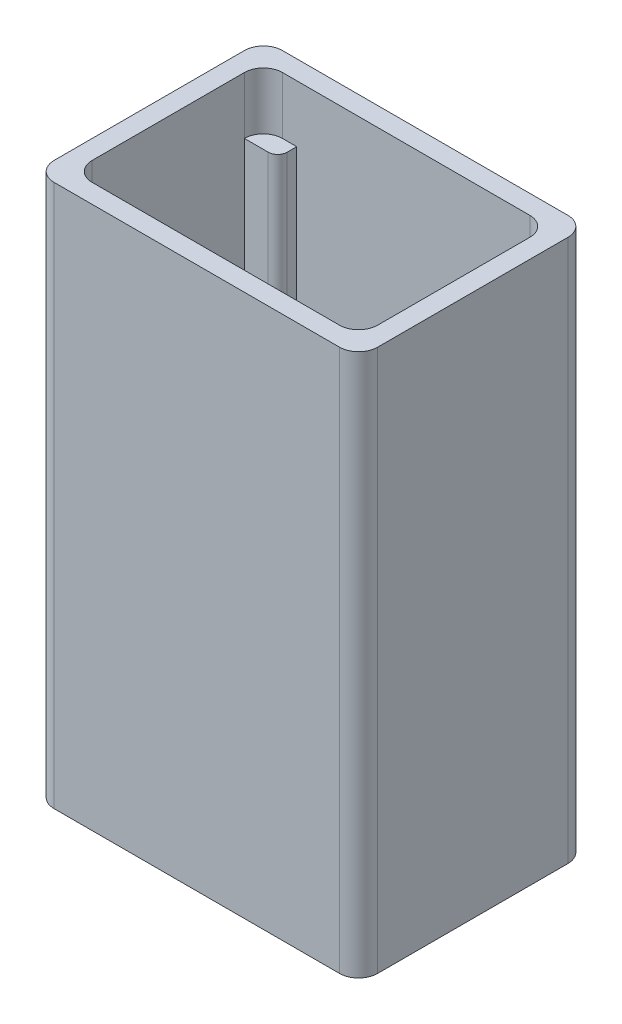
ISO-10303-21;
HEADER;
FILE_DESCRIPTION(('STEP AP214'),'2;1');
FILE_NAME('part.step','',(''),(''),'','','');
FILE_SCHEMA(('AUTOMOTIVE_DESIGN { 1 0 10303 214 1 1 1 1 }'));
ENDSEC;
DATA;
#1=APPLICATION_CONTEXT('core data for automotive mechanical design processes');
#2=APPLICATION_PROTOCOL_DEFINITION('international standard','automotive_design',2000,#1);
#3=PRODUCT_CONTEXT('',#1,'mechanical');
#4=PRODUCT('Part','Part','',(#3));
#5=PRODUCT_RELATED_PRODUCT_CATEGORY('part','',(#4));
#6=PRODUCT_DEFINITION_FORMATION('','',#4);
#7=PRODUCT_DEFINITION_CONTEXT('part definition',#1,'design');
#8=PRODUCT_DEFINITION('design','',#6,#7);
#9=PRODUCT_DEFINITION_SHAPE('','',#8);
#10=(LENGTH_UNIT() NAMED_UNIT(*) SI_UNIT(.MILLI.,.METRE.));
#11=(NAMED_UNIT(*) PLANE_ANGLE_UNIT() SI_UNIT($,.RADIAN.));
#12=(NAMED_UNIT(*) SI_UNIT($,.STERADIAN.) SOLID_ANGLE_UNIT());
#13=UNCERTAINTY_MEASURE_WITH_UNIT(LENGTH_MEASURE(1.E-05),#10,'distance_accuracy_value','');
#14=(GEOMETRIC_REPRESENTATION_CONTEXT(3) GLOBAL_UNCERTAINTY_ASSIGNED_CONTEXT((#13)) GLOBAL_UNIT_ASSIGNED_CONTEXT((#10,
#11,#12)) REPRESENTATION_CONTEXT('',''));
#15=CARTESIAN_POINT('',(0.,0.,0.));
#16=DIRECTION('',(0.,0.,1.));
#17=DIRECTION('',(1.,0.,0.));
#18=AXIS2_PLACEMENT_3D('',#15,#16,#17);
#19=CARTESIAN_POINT('',(-13.,115.,-10.));
#20=DIRECTION('',(0.,0.,1.));
#21=DIRECTION('',(1.,0.,0.));
#22=AXIS2_PLACEMENT_3D('',#19,#20,#21);
#23=PLANE('',#22);
#24=DIRECTION('',(-1.,0.,0.));
#25=VECTOR('',#24,1.);
#26=CARTESIAN_POINT('',(-11.5,109.,-10.));
#27=LINE('',#26,#25);
#28=CARTESIAN_POINT('',(-11.5,109.,-10.));
#29=VERTEX_POINT('',#28);
#30=CARTESIAN_POINT('',(-13.,109.,-10.));
#31=VERTEX_POINT('',#30);
#32=EDGE_CURVE('E47',#29,#31,#27,.T.);
#33=ORIENTED_EDGE('',*,*,#32,.F.);
#34=DIRECTION('',(0.,-1.,0.));
#35=VECTOR('',#34,1.);
#36=CARTESIAN_POINT('',(-11.5,109.,-10.));
#37=LINE('',#36,#35);
#38=CARTESIAN_POINT('',(-11.5,58.,-10.));
#39=VERTEX_POINT('',#38);
#40=EDGE_CURVE('E52',#29,#39,#37,.T.);
#41=ORIENTED_EDGE('',*,*,#40,.T.);
#42=DIRECTION('',(-1.,0.,0.));
#43=VECTOR('',#42,1.);
#44=CARTESIAN_POINT('',(-13.,58.,-10.));
#45=LINE('',#44,#43);
#46=CARTESIAN_POINT('',(11.5,58.,-10.));
#47=VERTEX_POINT('',#46);
#48=EDGE_CURVE('E274',#47,#39,#45,.T.);
#49=ORIENTED_EDGE('',*,*,#48,.F.);
#50=DIRECTION('',(0.,-1.,0.));
#51=VECTOR('',#50,1.);
#52=CARTESIAN_POINT('',(11.5,109.,-10.));
#53=LINE('',#52,#51);
#54=CARTESIAN_POINT('',(11.5,109.,-10.));
#55=VERTEX_POINT('',#54);
#56=EDGE_CURVE('E243',#55,#47,#53,.T.);
#57=ORIENTED_EDGE('',*,*,#56,.F.);
#58=DIRECTION('',(1.,0.,0.));
#59=VECTOR('',#58,1.);
#60=CARTESIAN_POINT('',(-13.,109.,-10.));
#61=LINE('',#60,#59);
#62=CARTESIAN_POINT('',(13.,109.,-10.));
#63=VERTEX_POINT('',#62);
#64=EDGE_CURVE('E40',#55,#63,#61,.T.);
#65=ORIENTED_EDGE('',*,*,#64,.T.);
#66=DIRECTION('',(0.,-1.,0.));
#67=VECTOR('',#66,1.);
#68=CARTESIAN_POINT('',(13.,115.,-10.));
#69=LINE('',#68,#67);
#70=CARTESIAN_POINT('',(13.,115.,-10.));
#71=VERTEX_POINT('',#70);
#72=EDGE_CURVE('E295',#71,#63,#69,.T.);
#73=ORIENTED_EDGE('',*,*,#72,.F.);
#74=DIRECTION('',(-1.,0.,0.));
#75=VECTOR('',#74,1.);
#76=CARTESIAN_POINT('',(-13.,115.,-10.));
#77=LINE('',#76,#75);
#78=CARTESIAN_POINT('',(-13.,115.,-10.));
#79=VERTEX_POINT('',#78);
#80=EDGE_CURVE('E257',#71,#79,#77,.T.);
#81=ORIENTED_EDGE('',*,*,#80,.T.);
#82=DIRECTION('',(0.,-1.,0.));
#83=VECTOR('',#82,1.);
#84=CARTESIAN_POINT('',(-13.,115.,-10.));
#85=LINE('',#84,#83);
#86=EDGE_CURVE('E293',#79,#31,#85,.T.);
#87=ORIENTED_EDGE('',*,*,#86,.T.);
#88=EDGE_LOOP('',(#33,#41,#49,#57,#65,#73,#81,#87));
#89=FACE_BOUND('',#88,.T.);
#90=ADVANCED_FACE('F32',(#89),#23,.T.);
#91=CARTESIAN_POINT('',(13.,115.,-8.00000000000001));
#92=DIRECTION('',(0.,-1.,0.));
#93=DIRECTION('',(0.,0.,-1.));
#94=AXIS2_PLACEMENT_3D('',#91,#92,#93);
#95=CYLINDRICAL_SURFACE('',#94,2.);
#96=ORIENTED_EDGE('',*,*,#72,.T.);
#97=CARTESIAN_POINT('',(13.,109.,-8.00000000000001));
#98=DIRECTION('',(0.,-1.,0.));
#99=DIRECTION('',(0.,0.,-1.));
#100=AXIS2_PLACEMENT_3D('',#97,#98,#99);
#101=CIRCLE('',#100,2.);
#102=CARTESIAN_POINT('',(15.,109.,-7.99999999999999));
#103=VERTEX_POINT('',#102);
#104=EDGE_CURVE('E246',#63,#103,#101,.T.);
#105=ORIENTED_EDGE('',*,*,#104,.T.);
#106=DIRECTION('',(0.,-1.,0.));
#107=VECTOR('',#106,1.);
#108=CARTESIAN_POINT('',(15.,115.,-7.99999999999999));
#109=LINE('',#108,#107);
#110=CARTESIAN_POINT('',(15.,115.,-7.99999999999999));
#111=VERTEX_POINT('',#110);
#112=EDGE_CURVE('E298',#111,#103,#109,.T.);
#113=ORIENTED_EDGE('',*,*,#112,.F.);
#114=CARTESIAN_POINT('',(13.,115.,-8.00000000000001));
#115=DIRECTION('',(0.,1.,0.));
#116=DIRECTION('',(0.,0.,-1.));
#117=AXIS2_PLACEMENT_3D('',#114,#115,#116);
#118=CIRCLE('',#117,2.);
#119=EDGE_CURVE('E255',#111,#71,#118,.T.);
#120=ORIENTED_EDGE('',*,*,#119,.T.);
#121=EDGE_LOOP('',(#96,#105,#113,#120));
#122=FACE_BOUND('',#121,.T.);
#123=ADVANCED_FACE('F368',(#122),#95,.F.);
#124=CARTESIAN_POINT('',(15.,115.,10.));
#125=DIRECTION('',(0.,-1.,0.));
#126=DIRECTION('',(0.,0.,-1.));
#127=AXIS2_PLACEMENT_3D('',#124,#125,#126);
#128=PLANE('',#127);
#129=CARTESIAN_POINT('',(15.,115.,10.));
#130=DIRECTION('',(0.,1.,0.));
#131=DIRECTION('',(0.,0.,-1.));
#132=AXIS2_PLACEMENT_3D('',#129,#130,#131);
#133=CIRCLE('',#132,2.);
#134=CARTESIAN_POINT('',(15.,115.,12.));
#135=VERTEX_POINT('',#134);
#136=CARTESIAN_POINT('',(17.,115.,10.));
#137=VERTEX_POINT('',#136);
#138=EDGE_CURVE('E305',#135,#137,#133,.T.);
#139=ORIENTED_EDGE('',*,*,#138,.T.);
#140=DIRECTION('',(0.,0.,-1.));
#141=VECTOR('',#140,1.);
#142=CARTESIAN_POINT('',(17.,115.,10.));
#143=LINE('',#142,#141);
#144=CARTESIAN_POINT('',(17.,115.,-10.));
#145=VERTEX_POINT('',#144);
#146=EDGE_CURVE('E308',#137,#145,#143,.T.);
#147=ORIENTED_EDGE('',*,*,#146,.T.);
#148=CARTESIAN_POINT('',(15.,115.,-10.));
#149=DIRECTION('',(0.,1.,0.));
#150=DIRECTION('',(0.,0.,-1.));
#151=AXIS2_PLACEMENT_3D('',#148,#149,#150);
#152=CIRCLE('',#151,2.);
#153=CARTESIAN_POINT('',(15.,115.,-12.));
#154=VERTEX_POINT('',#153);
#155=EDGE_CURVE('E311',#145,#154,#152,.T.);
#156=ORIENTED_EDGE('',*,*,#155,.T.);
#157=DIRECTION('',(-1.,0.,0.));
#158=VECTOR('',#157,1.);
#159=CARTESIAN_POINT('',(-15.,115.,-12.));
#160=LINE('',#159,#158);
#161=CARTESIAN_POINT('',(-15.,115.,-12.));
#162=VERTEX_POINT('',#161);
#163=EDGE_CURVE('E313',#154,#162,#160,.T.);
#164=ORIENTED_EDGE('',*,*,#163,.T.);
#165=CARTESIAN_POINT('',(-15.,115.,-10.));
#166=DIRECTION('',(0.,1.,0.));
#167=DIRECTION('',(0.,0.,1.));
#168=AXIS2_PLACEMENT_3D('',#165,#166,#167);
#169=CIRCLE('',#168,2.);
#170=CARTESIAN_POINT('',(-17.,115.,-10.));
#171=VERTEX_POINT('',#170);
#172=EDGE_CURVE('E315',#162,#171,#169,.T.);
#173=ORIENTED_EDGE('',*,*,#172,.T.);
#174=DIRECTION('',(0.,0.,1.));
#175=VECTOR('',#174,1.);
#176=CARTESIAN_POINT('',(-17.,115.,10.));
#177=LINE('',#176,#175);
#178=CARTESIAN_POINT('',(-17.,115.,10.));
#179=VERTEX_POINT('',#178);
#180=EDGE_CURVE('E317',#171,#179,#177,.T.);
#181=ORIENTED_EDGE('',*,*,#180,.T.);
#182=CARTESIAN_POINT('',(-15.,115.,10.));
#183=DIRECTION('',(0.,1.,0.));
#184=DIRECTION('',(0.,0.,1.));
#185=AXIS2_PLACEMENT_3D('',#182,#183,#184);
#186=CIRCLE('',#185,2.);
#187=CARTESIAN_POINT('',(-15.,115.,12.));
#188=VERTEX_POINT('',#187);
#189=EDGE_CURVE('E319',#179,#188,#186,.T.);
#190=ORIENTED_EDGE('',*,*,#189,.T.);
#191=DIRECTION('',(1.,0.,0.));
#192=VECTOR('',#191,1.);
#193=CARTESIAN_POINT('',(-15.,115.,12.));
#194=LINE('',#193,#192);
#195=EDGE_CURVE('E321',#188,#135,#194,.T.);
#196=ORIENTED_EDGE('',*,*,#195,.T.);
#197=EDGE_LOOP('',(#139,#147,#156,#164,#173,#181,#190,#196));
#198=FACE_BOUND('',#197,.T.);
#199=CARTESIAN_POINT('',(13.,115.,8.));
#200=DIRECTION('',(0.,1.,0.));
#201=DIRECTION('',(0.,0.,-1.));
#202=AXIS2_PLACEMENT_3D('',#199,#200,#201);
#203=CIRCLE('',#202,2.);
#204=CARTESIAN_POINT('',(13.,115.,10.));
#205=VERTEX_POINT('',#204);
#206=CARTESIAN_POINT('',(15.,115.,8.));
#207=VERTEX_POINT('',#206);
#208=EDGE_CURVE('E250',#205,#207,#203,.T.);
#209=ORIENTED_EDGE('',*,*,#208,.F.);
#210=DIRECTION('',(1.,0.,0.));
#211=VECTOR('',#210,1.);
#212=CARTESIAN_POINT('',(-13.,115.,10.));
#213=LINE('',#212,#211);
#214=CARTESIAN_POINT('',(-13.,115.,10.));
#215=VERTEX_POINT('',#214);
#216=EDGE_CURVE('E266',#215,#205,#213,.T.);
#217=ORIENTED_EDGE('',*,*,#216,.F.);
#218=CARTESIAN_POINT('',(-13.,115.,8.));
#219=DIRECTION('',(0.,1.,0.));
#220=DIRECTION('',(0.,0.,1.));
#221=AXIS2_PLACEMENT_3D('',#218,#219,#220);
#222=CIRCLE('',#221,2.);
#223=CARTESIAN_POINT('',(-15.,115.,8.));
#224=VERTEX_POINT('',#223);
#225=EDGE_CURVE('E263',#224,#215,#222,.T.);
#226=ORIENTED_EDGE('',*,*,#225,.F.);
#227=DIRECTION('',(0.,0.,1.));
#228=VECTOR('',#227,1.);
#229=CARTESIAN_POINT('',(-15.,115.,8.));
#230=LINE('',#229,#228);
#231=CARTESIAN_POINT('',(-15.,115.,-7.99999999999999));
#232=VERTEX_POINT('',#231);
#233=EDGE_CURVE('E261',#232,#224,#230,.T.);
#234=ORIENTED_EDGE('',*,*,#233,.F.);
#235=CARTESIAN_POINT('',(-13.,115.,-8.));
#236=DIRECTION('',(0.,1.,0.));
#237=DIRECTION('',(0.,0.,1.));
#238=AXIS2_PLACEMENT_3D('',#235,#236,#237);
#239=CIRCLE('',#238,2.);
#240=EDGE_CURVE('E259',#79,#232,#239,.T.);
#241=ORIENTED_EDGE('',*,*,#240,.F.);
#242=ORIENTED_EDGE('',*,*,#80,.F.);
#243=ORIENTED_EDGE('',*,*,#119,.F.);
#244=DIRECTION('',(0.,0.,-1.));
#245=VECTOR('',#244,1.);
#246=CARTESIAN_POINT('',(15.,115.,8.));
#247=LINE('',#246,#245);
#248=EDGE_CURVE('E252',#207,#111,#247,.T.);
#249=ORIENTED_EDGE('',*,*,#248,.F.);
#250=EDGE_LOOP('',(#209,#217,#226,#234,#241,#242,#243,#249));
#251=FACE_BOUND('',#250,.T.);
#252=ADVANCED_FACE('F374',(#198,#251),#128,.F.);
#253=CARTESIAN_POINT('',(15.,58.,10.));
#254=DIRECTION('',(0.,-1.,0.));
#255=DIRECTION('',(0.,0.,-1.));
#256=AXIS2_PLACEMENT_3D('',#253,#254,#255);
#257=PLANE('',#256);
#258=ORIENTED_EDGE('',*,*,#48,.T.);
#259=DIRECTION('',(0.,0.,-1.));
#260=VECTOR('',#259,1.);
#261=CARTESIAN_POINT('',(-11.5,58.,-9.));
#262=LINE('',#261,#260);
#263=CARTESIAN_POINT('',(-11.5,58.,-9.));
#264=VERTEX_POINT('',#263);
#265=EDGE_CURVE('E213',#264,#39,#262,.T.);
#266=ORIENTED_EDGE('',*,*,#265,.F.);
#267=CARTESIAN_POINT('',(-12.5,58.,-8.99999999999999));
#268=DIRECTION('',(0.,1.,0.));
#269=DIRECTION('',(0.,0.,1.));
#270=AXIS2_PLACEMENT_3D('',#267,#268,#269);
#271=CIRCLE('',#270,1.);
#272=CARTESIAN_POINT('',(-12.5,58.,-7.99999999999999));
#273=VERTEX_POINT('',#272);
#274=EDGE_CURVE('E217',#273,#264,#271,.T.);
#275=ORIENTED_EDGE('',*,*,#274,.F.);
#276=DIRECTION('',(1.,0.,0.));
#277=VECTOR('',#276,1.);
#278=CARTESIAN_POINT('',(-15.,58.,-7.99999999999999));
#279=LINE('',#278,#277);
#280=CARTESIAN_POINT('',(-15.,58.,-7.99999999999999));
#281=VERTEX_POINT('',#280);
#282=EDGE_CURVE('E200',#281,#273,#279,.T.);
#283=ORIENTED_EDGE('',*,*,#282,.F.);
#284=DIRECTION('',(0.,0.,1.));
#285=VECTOR('',#284,1.);
#286=CARTESIAN_POINT('',(-15.,58.,8.));
#287=LINE('',#286,#285);
#288=CARTESIAN_POINT('',(-15.,58.,8.));
#289=VERTEX_POINT('',#288);
#290=EDGE_CURVE('E276',#281,#289,#287,.T.);
#291=ORIENTED_EDGE('',*,*,#290,.T.);
#292=CARTESIAN_POINT('',(-13.,58.,8.));
#293=DIRECTION('',(0.,1.,0.));
#294=DIRECTION('',(0.,0.,1.));
#295=AXIS2_PLACEMENT_3D('',#292,#293,#294);
#296=CIRCLE('',#295,2.);
#297=CARTESIAN_POINT('',(-13.,58.,10.));
#298=VERTEX_POINT('',#297);
#299=EDGE_CURVE('E279',#289,#298,#296,.T.);
#300=ORIENTED_EDGE('',*,*,#299,.T.);
#301=DIRECTION('',(1.,0.,0.));
#302=VECTOR('',#301,1.);
#303=CARTESIAN_POINT('',(-13.,58.,10.));
#304=LINE('',#303,#302);
#305=CARTESIAN_POINT('',(13.,58.,10.));
#306=VERTEX_POINT('',#305);
#307=EDGE_CURVE('E253',#298,#306,#304,.T.);
#308=ORIENTED_EDGE('',*,*,#307,.T.);
#309=CARTESIAN_POINT('',(13.,58.,8.));
#310=DIRECTION('',(0.,1.,0.));
#311=DIRECTION('',(0.,0.,-1.));
#312=AXIS2_PLACEMENT_3D('',#309,#310,#311);
#313=CIRCLE('',#312,2.);
#314=CARTESIAN_POINT('',(15.,58.,8.));
#315=VERTEX_POINT('',#314);
#316=EDGE_CURVE('E249',#306,#315,#313,.T.);
#317=ORIENTED_EDGE('',*,*,#316,.T.);
#318=DIRECTION('',(0.,0.,-1.));
#319=VECTOR('',#318,1.);
#320=CARTESIAN_POINT('',(15.,58.,8.));
#321=LINE('',#320,#319);
#322=CARTESIAN_POINT('',(15.,58.,-7.99999999999999));
#323=VERTEX_POINT('',#322);
#324=EDGE_CURVE('E271',#315,#323,#321,.T.);
#325=ORIENTED_EDGE('',*,*,#324,.T.);
#326=DIRECTION('',(1.,0.,0.));
#327=VECTOR('',#326,1.);
#328=CARTESIAN_POINT('',(15.,58.,-7.99999999999999));
#329=LINE('',#328,#327);
#330=CARTESIAN_POINT('',(12.5,58.,-7.99999999999999));
#331=VERTEX_POINT('',#330);
#332=EDGE_CURVE('E226',#331,#323,#329,.T.);
#333=ORIENTED_EDGE('',*,*,#332,.F.);
#334=CARTESIAN_POINT('',(12.5,58.,-8.99999999999999));
#335=DIRECTION('',(0.,1.,0.));
#336=DIRECTION('',(0.,0.,-1.));
#337=AXIS2_PLACEMENT_3D('',#334,#335,#336);
#338=CIRCLE('',#337,1.);
#339=CARTESIAN_POINT('',(11.5,58.,-9.));
#340=VERTEX_POINT('',#339);
#341=EDGE_CURVE('E232',#340,#331,#338,.T.);
#342=ORIENTED_EDGE('',*,*,#341,.F.);
#343=DIRECTION('',(0.,0.,1.));
#344=VECTOR('',#343,1.);
#345=CARTESIAN_POINT('',(11.5,58.,-9.));
#346=LINE('',#345,#344);
#347=EDGE_CURVE('E222',#47,#340,#346,.T.);
#348=ORIENTED_EDGE('',*,*,#347,.F.);
#349=EDGE_LOOP('',(#258,#266,#275,#283,#291,#300,#308,#317,#325,#333,#342,#348));
#350=FACE_BOUND('',#349,.T.);
#351=CARTESIAN_POINT('',(15.,58.,10.));
#352=DIRECTION('',(0.,1.,0.));
#353=DIRECTION('',(0.,0.,-1.));
#354=AXIS2_PLACEMENT_3D('',#351,#352,#353);
#355=CIRCLE('',#354,2.);
#356=CARTESIAN_POINT('',(15.,58.,12.));
#357=VERTEX_POINT('',#356);
#358=CARTESIAN_POINT('',(17.,58.,10.));
#359=VERTEX_POINT('',#358);
#360=EDGE_CURVE('E304',#357,#359,#355,.T.);
#361=ORIENTED_EDGE('',*,*,#360,.F.);
#362=DIRECTION('',(1.,0.,0.));
#363=VECTOR('',#362,1.);
#364=CARTESIAN_POINT('',(-15.,58.,12.));
#365=LINE('',#364,#363);
#366=CARTESIAN_POINT('',(-15.,58.,12.));
#367=VERTEX_POINT('',#366);
#368=EDGE_CURVE('E309',#367,#357,#365,.T.);
#369=ORIENTED_EDGE('',*,*,#368,.F.);
#370=CARTESIAN_POINT('',(-15.,58.,10.));
#371=DIRECTION('',(0.,1.,0.));
#372=DIRECTION('',(0.,0.,1.));
#373=AXIS2_PLACEMENT_3D('',#370,#371,#372);
#374=CIRCLE('',#373,2.);
#375=CARTESIAN_POINT('',(-17.,58.,10.));
#376=VERTEX_POINT('',#375);
#377=EDGE_CURVE('E336',#376,#367,#374,.T.);
#378=ORIENTED_EDGE('',*,*,#377,.F.);
#379=DIRECTION('',(0.,0.,1.));
#380=VECTOR('',#379,1.);
#381=CARTESIAN_POINT('',(-17.,58.,10.));
#382=LINE('',#381,#380);
#383=CARTESIAN_POINT('',(-17.,58.,-10.));
#384=VERTEX_POINT('',#383);
#385=EDGE_CURVE('E334',#384,#376,#382,.T.);
#386=ORIENTED_EDGE('',*,*,#385,.F.);
#387=CARTESIAN_POINT('',(-15.,58.,-10.));
#388=DIRECTION('',(0.,1.,0.));
#389=DIRECTION('',(0.,0.,1.));
#390=AXIS2_PLACEMENT_3D('',#387,#388,#389);
#391=CIRCLE('',#390,2.);
#392=CARTESIAN_POINT('',(-15.,58.,-12.));
#393=VERTEX_POINT('',#392);
#394=EDGE_CURVE('E332',#393,#384,#391,.T.);
#395=ORIENTED_EDGE('',*,*,#394,.F.);
#396=DIRECTION('',(-1.,0.,0.));
#397=VECTOR('',#396,1.);
#398=CARTESIAN_POINT('',(-15.,58.,-12.));
#399=LINE('',#398,#397);
#400=CARTESIAN_POINT('',(15.,58.,-12.));
#401=VERTEX_POINT('',#400);
#402=EDGE_CURVE('E330',#401,#393,#399,.T.);
#403=ORIENTED_EDGE('',*,*,#402,.F.);
#404=CARTESIAN_POINT('',(15.,58.,-10.));
#405=DIRECTION('',(0.,1.,0.));
#406=DIRECTION('',(0.,0.,-1.));
#407=AXIS2_PLACEMENT_3D('',#404,#405,#406);
#408=CIRCLE('',#407,2.);
#409=CARTESIAN_POINT('',(17.,58.,-10.));
#410=VERTEX_POINT('',#409);
#411=EDGE_CURVE('E328',#410,#401,#408,.T.);
#412=ORIENTED_EDGE('',*,*,#411,.F.);
#413=DIRECTION('',(0.,0.,-1.));
#414=VECTOR('',#413,1.);
#415=CARTESIAN_POINT('',(17.,58.,10.));
#416=LINE('',#415,#414);
#417=EDGE_CURVE('E326',#359,#410,#416,.T.);
#418=ORIENTED_EDGE('',*,*,#417,.F.);
#419=EDGE_LOOP('',(#361,#369,#378,#386,#395,#403,#412,#418));
#420=FACE_BOUND('',#419,.T.);
#421=ADVANCED_FACE('F391',(#350,#420),#257,.T.);
#422=CARTESIAN_POINT('',(15.,115.,10.));
#423=DIRECTION('',(0.,-1.,0.));
#424=DIRECTION('',(0.,0.,-1.));
#425=AXIS2_PLACEMENT_3D('',#422,#423,#424);
#426=CYLINDRICAL_SURFACE('',#425,2.);
#427=ORIENTED_EDGE('',*,*,#360,.T.);
#428=DIRECTION('',(0.,-1.,0.));
#429=VECTOR('',#428,1.);
#430=CARTESIAN_POINT('',(17.,115.,10.));
#431=LINE('',#430,#429);
#432=EDGE_CURVE('E359',#137,#359,#431,.T.);
#433=ORIENTED_EDGE('',*,*,#432,.F.);
#434=ORIENTED_EDGE('',*,*,#138,.F.);
#435=DIRECTION('',(0.,-1.,0.));
#436=VECTOR('',#435,1.);
#437=CARTESIAN_POINT('',(15.,115.,12.));
#438=LINE('',#437,#436);
#439=EDGE_CURVE('E323',#135,#357,#438,.T.);
#440=ORIENTED_EDGE('',*,*,#439,.T.);
#441=EDGE_LOOP('',(#427,#433,#434,#440));
#442=FACE_BOUND('',#441,.T.);
#443=ADVANCED_FACE('F34',(#442),#426,.T.);
#444=CARTESIAN_POINT('',(17.,115.,10.));
#445=DIRECTION('',(-1.,0.,0.));
#446=DIRECTION('',(0.,0.,1.));
#447=AXIS2_PLACEMENT_3D('',#444,#445,#446);
#448=PLANE('',#447);
#449=ORIENTED_EDGE('',*,*,#417,.T.);
#450=DIRECTION('',(0.,-1.,0.));
#451=VECTOR('',#450,1.);
#452=CARTESIAN_POINT('',(17.,115.,-10.));
#453=LINE('',#452,#451);
#454=EDGE_CURVE('E356',#145,#410,#453,.T.);
#455=ORIENTED_EDGE('',*,*,#454,.F.);
#456=ORIENTED_EDGE('',*,*,#146,.F.);
#457=ORIENTED_EDGE('',*,*,#432,.T.);
#458=EDGE_LOOP('',(#449,#455,#456,#457));
#459=FACE_BOUND('',#458,.T.);
#460=ADVANCED_FACE('F451',(#459),#448,.F.);
#461=CARTESIAN_POINT('',(15.,115.,-10.));
#462=DIRECTION('',(0.,-1.,0.));
#463=DIRECTION('',(0.,0.,-1.));
#464=AXIS2_PLACEMENT_3D('',#461,#462,#463);
#465=CYLINDRICAL_SURFACE('',#464,2.);
#466=ORIENTED_EDGE('',*,*,#411,.T.);
#467=DIRECTION('',(0.,-1.,0.));
#468=VECTOR('',#467,1.);
#469=CARTESIAN_POINT('',(15.,115.,-12.));
#470=LINE('',#469,#468);
#471=EDGE_CURVE('E353',#154,#401,#470,.T.);
#472=ORIENTED_EDGE('',*,*,#471,.F.);
#473=ORIENTED_EDGE('',*,*,#155,.F.);
#474=ORIENTED_EDGE('',*,*,#454,.T.);
#475=EDGE_LOOP('',(#466,#472,#473,#474));
#476=FACE_BOUND('',#475,.T.);
#477=ADVANCED_FACE('F448',(#476),#465,.T.);
#478=CARTESIAN_POINT('',(-15.,115.,-12.));
#479=DIRECTION('',(0.,0.,1.));
#480=DIRECTION('',(1.,0.,0.));
#481=AXIS2_PLACEMENT_3D('',#478,#479,#480);
#482=PLANE('',#481);
#483=ORIENTED_EDGE('',*,*,#402,.T.);
#484=DIRECTION('',(0.,-1.,0.));
#485=VECTOR('',#484,1.);
#486=CARTESIAN_POINT('',(-15.,115.,-12.));
#487=LINE('',#486,#485);
#488=EDGE_CURVE('E350',#162,#393,#487,.T.);
#489=ORIENTED_EDGE('',*,*,#488,.F.);
#490=ORIENTED_EDGE('',*,*,#163,.F.);
#491=ORIENTED_EDGE('',*,*,#471,.T.);
#492=EDGE_LOOP('',(#483,#489,#490,#491));
#493=FACE_BOUND('',#492,.T.);
#494=ADVANCED_FACE('F444',(#493),#482,.F.);
#495=CARTESIAN_POINT('',(-15.,115.,-10.));
#496=DIRECTION('',(0.,-1.,0.));
#497=DIRECTION('',(0.,0.,-1.));
#498=AXIS2_PLACEMENT_3D('',#495,#496,#497);
#499=CYLINDRICAL_SURFACE('',#498,2.);
#500=ORIENTED_EDGE('',*,*,#394,.T.);
#501=DIRECTION('',(0.,-1.,0.));
#502=VECTOR('',#501,1.);
#503=CARTESIAN_POINT('',(-17.,115.,-10.));
#504=LINE('',#503,#502);
#505=EDGE_CURVE('E347',#171,#384,#504,.T.);
#506=ORIENTED_EDGE('',*,*,#505,.F.);
#507=ORIENTED_EDGE('',*,*,#172,.F.);
#508=ORIENTED_EDGE('',*,*,#488,.T.);
#509=EDGE_LOOP('',(#500,#506,#507,#508));
#510=FACE_BOUND('',#509,.T.);
#511=ADVANCED_FACE('F440',(#510),#499,.T.);
#512=CARTESIAN_POINT('',(-17.,115.,10.));
#513=DIRECTION('',(1.,0.,0.));
#514=DIRECTION('',(0.,0.,-1.));
#515=AXIS2_PLACEMENT_3D('',#512,#513,#514);
#516=PLANE('',#515);
#517=ORIENTED_EDGE('',*,*,#385,.T.);
#518=DIRECTION('',(0.,-1.,0.));
#519=VECTOR('',#518,1.);
#520=CARTESIAN_POINT('',(-17.,115.,10.));
#521=LINE('',#520,#519);
#522=EDGE_CURVE('E344',#179,#376,#521,.T.);
#523=ORIENTED_EDGE('',*,*,#522,.F.);
#524=ORIENTED_EDGE('',*,*,#180,.F.);
#525=ORIENTED_EDGE('',*,*,#505,.T.);
#526=EDGE_LOOP('',(#517,#523,#524,#525));
#527=FACE_BOUND('',#526,.T.);
#528=ADVANCED_FACE('F436',(#527),#516,.F.);
#529=CARTESIAN_POINT('',(-15.,115.,10.));
#530=DIRECTION('',(0.,-1.,0.));
#531=DIRECTION('',(0.,0.,-1.));
#532=AXIS2_PLACEMENT_3D('',#529,#530,#531);
#533=CYLINDRICAL_SURFACE('',#532,2.);
#534=ORIENTED_EDGE('',*,*,#377,.T.);
#535=DIRECTION('',(0.,-1.,0.));
#536=VECTOR('',#535,1.);
#537=CARTESIAN_POINT('',(-15.,115.,12.));
#538=LINE('',#537,#536);
#539=EDGE_CURVE('E341',#188,#367,#538,.T.);
#540=ORIENTED_EDGE('',*,*,#539,.F.);
#541=ORIENTED_EDGE('',*,*,#189,.F.);
#542=ORIENTED_EDGE('',*,*,#522,.T.);
#543=EDGE_LOOP('',(#534,#540,#541,#542));
#544=FACE_BOUND('',#543,.T.);
#545=ADVANCED_FACE('F432',(#544),#533,.T.);
#546=CARTESIAN_POINT('',(-15.,115.,12.));
#547=DIRECTION('',(0.,0.,-1.));
#548=DIRECTION('',(-1.,0.,0.));
#549=AXIS2_PLACEMENT_3D('',#546,#547,#548);
#550=PLANE('',#549);
#551=ORIENTED_EDGE('',*,*,#368,.T.);
#552=ORIENTED_EDGE('',*,*,#439,.F.);
#553=ORIENTED_EDGE('',*,*,#195,.F.);
#554=ORIENTED_EDGE('',*,*,#539,.T.);
#555=EDGE_LOOP('',(#551,#552,#553,#554));
#556=FACE_BOUND('',#555,.T.);
#557=ADVANCED_FACE('F423',(#556),#550,.F.);
#558=CARTESIAN_POINT('',(13.,115.,8.));
#559=DIRECTION('',(0.,-1.,0.));
#560=DIRECTION('',(0.,0.,-1.));
#561=AXIS2_PLACEMENT_3D('',#558,#559,#560);
#562=CYLINDRICAL_SURFACE('',#561,2.);
#563=ORIENTED_EDGE('',*,*,#316,.F.);
#564=DIRECTION('',(0.,-1.,0.));
#565=VECTOR('',#564,1.);
#566=CARTESIAN_POINT('',(13.,115.,10.));
#567=LINE('',#566,#565);
#568=EDGE_CURVE('E268',#205,#306,#567,.T.);
#569=ORIENTED_EDGE('',*,*,#568,.F.);
#570=ORIENTED_EDGE('',*,*,#208,.T.);
#571=DIRECTION('',(0.,-1.,0.));
#572=VECTOR('',#571,1.);
#573=CARTESIAN_POINT('',(15.,115.,8.));
#574=LINE('',#573,#572);
#575=EDGE_CURVE('E301',#207,#315,#574,.T.);
#576=ORIENTED_EDGE('',*,*,#575,.T.);
#577=EDGE_LOOP('',(#563,#569,#570,#576));
#578=FACE_BOUND('',#577,.T.);
#579=ADVANCED_FACE('F419',(#578),#562,.F.);
#580=CARTESIAN_POINT('',(15.,115.,8.));
#581=DIRECTION('',(-1.,0.,0.));
#582=DIRECTION('',(0.,0.,1.));
#583=AXIS2_PLACEMENT_3D('',#580,#581,#582);
#584=PLANE('',#583);
#585=ORIENTED_EDGE('',*,*,#324,.F.);
#586=ORIENTED_EDGE('',*,*,#575,.F.);
#587=ORIENTED_EDGE('',*,*,#248,.T.);
#588=ORIENTED_EDGE('',*,*,#112,.T.);
#589=DIRECTION('',(0.,-1.,0.));
#590=VECTOR('',#589,1.);
#591=CARTESIAN_POINT('',(15.,109.,-7.99999999999999));
#592=LINE('',#591,#590);
#593=EDGE_CURVE('E230',#103,#323,#592,.T.);
#594=ORIENTED_EDGE('',*,*,#593,.T.);
#595=EDGE_LOOP('',(#585,#586,#587,#588,#594));
#596=FACE_BOUND('',#595,.T.);
#597=ADVANCED_FACE('F416',(#596),#584,.T.);
#598=CARTESIAN_POINT('',(-13.,115.,-8.));
#599=DIRECTION('',(0.,-1.,0.));
#600=DIRECTION('',(0.,0.,-1.));
#601=AXIS2_PLACEMENT_3D('',#598,#599,#600);
#602=CYLINDRICAL_SURFACE('',#601,2.);
#603=CARTESIAN_POINT('',(-13.,109.,-8.));
#604=DIRECTION('',(0.,1.,0.));
#605=DIRECTION('',(0.,0.,1.));
#606=AXIS2_PLACEMENT_3D('',#603,#604,#605);
#607=CIRCLE('',#606,2.);
#608=CARTESIAN_POINT('',(-15.,109.,-7.99999999999999));
#609=VERTEX_POINT('',#608);
#610=EDGE_CURVE('E11',#31,#609,#607,.T.);
#611=ORIENTED_EDGE('',*,*,#610,.F.);
#612=ORIENTED_EDGE('',*,*,#86,.F.);
#613=ORIENTED_EDGE('',*,*,#240,.T.);
#614=DIRECTION('',(0.,-1.,0.));
#615=VECTOR('',#614,1.);
#616=CARTESIAN_POINT('',(-15.,115.,-7.99999999999999));
#617=LINE('',#616,#615);
#618=EDGE_CURVE('E290',#232,#609,#617,.T.);
#619=ORIENTED_EDGE('',*,*,#618,.T.);
#620=EDGE_LOOP('',(#611,#612,#613,#619));
#621=FACE_BOUND('',#620,.T.);
#622=ADVANCED_FACE('F379',(#621),#602,.F.);
#623=CARTESIAN_POINT('',(-15.,115.,8.));
#624=DIRECTION('',(1.,0.,0.));
#625=DIRECTION('',(0.,0.,-1.));
#626=AXIS2_PLACEMENT_3D('',#623,#624,#625);
#627=PLANE('',#626);
#628=ORIENTED_EDGE('',*,*,#290,.F.);
#629=DIRECTION('',(0.,-1.,0.));
#630=VECTOR('',#629,1.);
#631=CARTESIAN_POINT('',(-15.,109.,-7.99999999999999));
#632=LINE('',#631,#630);
#633=EDGE_CURVE('E203',#609,#281,#632,.T.);
#634=ORIENTED_EDGE('',*,*,#633,.F.);
#635=ORIENTED_EDGE('',*,*,#618,.F.);
#636=ORIENTED_EDGE('',*,*,#233,.T.);
#637=DIRECTION('',(0.,-1.,0.));
#638=VECTOR('',#637,1.);
#639=CARTESIAN_POINT('',(-15.,115.,8.));
#640=LINE('',#639,#638);
#641=EDGE_CURVE('E288',#224,#289,#640,.T.);
#642=ORIENTED_EDGE('',*,*,#641,.T.);
#643=EDGE_LOOP('',(#628,#634,#635,#636,#642));
#644=FACE_BOUND('',#643,.T.);
#645=ADVANCED_FACE('F382',(#644),#627,.T.);
#646=CARTESIAN_POINT('',(-13.,115.,8.));
#647=DIRECTION('',(0.,-1.,0.));
#648=DIRECTION('',(0.,0.,-1.));
#649=AXIS2_PLACEMENT_3D('',#646,#647,#648);
#650=CYLINDRICAL_SURFACE('',#649,2.);
#651=ORIENTED_EDGE('',*,*,#299,.F.);
#652=ORIENTED_EDGE('',*,*,#641,.F.);
#653=ORIENTED_EDGE('',*,*,#225,.T.);
#654=DIRECTION('',(0.,-1.,0.));
#655=VECTOR('',#654,1.);
#656=CARTESIAN_POINT('',(-13.,115.,10.));
#657=LINE('',#656,#655);
#658=EDGE_CURVE('E286',#215,#298,#657,.T.);
#659=ORIENTED_EDGE('',*,*,#658,.T.);
#660=EDGE_LOOP('',(#651,#652,#653,#659));
#661=FACE_BOUND('',#660,.T.);
#662=ADVANCED_FACE('F388',(#661),#650,.F.);
#663=CARTESIAN_POINT('',(-13.,115.,10.));
#664=DIRECTION('',(0.,0.,-1.));
#665=DIRECTION('',(-1.,0.,0.));
#666=AXIS2_PLACEMENT_3D('',#663,#664,#665);
#667=PLANE('',#666);
#668=ORIENTED_EDGE('',*,*,#307,.F.);
#669=ORIENTED_EDGE('',*,*,#658,.F.);
#670=ORIENTED_EDGE('',*,*,#216,.T.);
#671=ORIENTED_EDGE('',*,*,#568,.T.);
#672=EDGE_LOOP('',(#668,#669,#670,#671));
#673=FACE_BOUND('',#672,.T.);
#674=ADVANCED_FACE('F507',(#673),#667,.T.);
#675=CARTESIAN_POINT('',(11.5,109.,-9.));
#676=DIRECTION('',(1.,0.,0.));
#677=DIRECTION('',(0.,0.,-1.));
#678=AXIS2_PLACEMENT_3D('',#675,#676,#677);
#679=PLANE('',#678);
#680=ORIENTED_EDGE('',*,*,#347,.T.);
#681=DIRECTION('',(0.,-1.,0.));
#682=VECTOR('',#681,1.);
#683=CARTESIAN_POINT('',(11.5,109.,-9.));
#684=LINE('',#683,#682);
#685=CARTESIAN_POINT('',(11.5,109.,-9.));
#686=VERTEX_POINT('',#685);
#687=EDGE_CURVE('E240',#686,#340,#684,.T.);
#688=ORIENTED_EDGE('',*,*,#687,.F.);
#689=DIRECTION('',(0.,0.,1.));
#690=VECTOR('',#689,1.);
#691=CARTESIAN_POINT('',(11.5,109.,-9.));
#692=LINE('',#691,#690);
#693=EDGE_CURVE('E223',#55,#686,#692,.T.);
#694=ORIENTED_EDGE('',*,*,#693,.F.);
#695=ORIENTED_EDGE('',*,*,#56,.T.);
#696=EDGE_LOOP('',(#680,#688,#694,#695));
#697=FACE_BOUND('',#696,.T.);
#698=ADVANCED_FACE('F511',(#697),#679,.F.);
#699=CARTESIAN_POINT('',(12.5,109.,-8.99999999999999));
#700=DIRECTION('',(0.,-1.,0.));
#701=DIRECTION('',(0.,0.,-1.));
#702=AXIS2_PLACEMENT_3D('',#699,#700,#701);
#703=CYLINDRICAL_SURFACE('',#702,1.);
#704=ORIENTED_EDGE('',*,*,#341,.T.);
#705=DIRECTION('',(0.,-1.,0.));
#706=VECTOR('',#705,1.);
#707=CARTESIAN_POINT('',(12.5,109.,-7.99999999999999));
#708=LINE('',#707,#706);
#709=CARTESIAN_POINT('',(12.5,109.,-7.99999999999999));
#710=VERTEX_POINT('',#709);
#711=EDGE_CURVE('E237',#710,#331,#708,.T.);
#712=ORIENTED_EDGE('',*,*,#711,.F.);
#713=CARTESIAN_POINT('',(12.5,109.,-8.99999999999999));
#714=DIRECTION('',(0.,1.,0.));
#715=DIRECTION('',(0.,0.,-1.));
#716=AXIS2_PLACEMENT_3D('',#713,#714,#715);
#717=CIRCLE('',#716,1.);
#718=EDGE_CURVE('E225',#686,#710,#717,.T.);
#719=ORIENTED_EDGE('',*,*,#718,.F.);
#720=ORIENTED_EDGE('',*,*,#687,.T.);
#721=EDGE_LOOP('',(#704,#712,#719,#720));
#722=FACE_BOUND('',#721,.T.);
#723=ADVANCED_FACE('F590',(#722),#703,.T.);
#724=CARTESIAN_POINT('',(15.,109.,-7.99999999999999));
#725=DIRECTION('',(0.,0.,-1.));
#726=DIRECTION('',(-1.,0.,0.));
#727=AXIS2_PLACEMENT_3D('',#724,#725,#726);
#728=PLANE('',#727);
#729=ORIENTED_EDGE('',*,*,#332,.T.);
#730=ORIENTED_EDGE('',*,*,#593,.F.);
#731=DIRECTION('',(1.,0.,0.));
#732=VECTOR('',#731,1.);
#733=CARTESIAN_POINT('',(15.,109.,-7.99999999999999));
#734=LINE('',#733,#732);
#735=EDGE_CURVE('E228',#710,#103,#734,.T.);
#736=ORIENTED_EDGE('',*,*,#735,.F.);
#737=ORIENTED_EDGE('',*,*,#711,.T.);
#738=EDGE_LOOP('',(#729,#730,#736,#737));
#739=FACE_BOUND('',#738,.T.);
#740=ADVANCED_FACE('F600',(#739),#728,.F.);
#741=CARTESIAN_POINT('',(12.5,109.,-8.99999999999999));
#742=DIRECTION('',(0.,-1.,0.));
#743=DIRECTION('',(0.,0.,-1.));
#744=AXIS2_PLACEMENT_3D('',#741,#742,#743);
#745=PLANE('',#744);
#746=ORIENTED_EDGE('',*,*,#104,.F.);
#747=ORIENTED_EDGE('',*,*,#64,.F.);
#748=ORIENTED_EDGE('',*,*,#693,.T.);
#749=ORIENTED_EDGE('',*,*,#718,.T.);
#750=ORIENTED_EDGE('',*,*,#735,.T.);
#751=EDGE_LOOP('',(#746,#747,#748,#749,#750));
#752=FACE_BOUND('',#751,.T.);
#753=ADVANCED_FACE('F404',(#752),#745,.F.);
#754=CARTESIAN_POINT('',(-12.5,109.,-8.99999999999999));
#755=DIRECTION('',(0.,1.,0.));
#756=DIRECTION('',(0.,0.,1.));
#757=AXIS2_PLACEMENT_3D('',#754,#755,#756);
#758=PLANE('',#757);
#759=ORIENTED_EDGE('',*,*,#32,.T.);
#760=ORIENTED_EDGE('',*,*,#610,.T.);
#761=DIRECTION('',(1.,0.,0.));
#762=VECTOR('',#761,1.);
#763=CARTESIAN_POINT('',(-15.,109.,-7.99999999999999));
#764=LINE('',#763,#762);
#765=CARTESIAN_POINT('',(-12.5,109.,-7.99999999999999));
#766=VERTEX_POINT('',#765);
#767=EDGE_CURVE('E187',#609,#766,#764,.T.);
#768=ORIENTED_EDGE('',*,*,#767,.T.);
#769=CARTESIAN_POINT('',(-12.5,109.,-8.99999999999999));
#770=DIRECTION('',(0.,1.,0.));
#771=DIRECTION('',(0.,0.,1.));
#772=AXIS2_PLACEMENT_3D('',#769,#770,#771);
#773=CIRCLE('',#772,1.);
#774=CARTESIAN_POINT('',(-11.5,109.,-9.));
#775=VERTEX_POINT('',#774);
#776=EDGE_CURVE('E191',#766,#775,#773,.T.);
#777=ORIENTED_EDGE('',*,*,#776,.T.);
#778=DIRECTION('',(0.,0.,-1.));
#779=VECTOR('',#778,1.);
#780=CARTESIAN_POINT('',(-11.5,109.,-9.));
#781=LINE('',#780,#779);
#782=EDGE_CURVE('E218',#775,#29,#781,.T.);
#783=ORIENTED_EDGE('',*,*,#782,.T.);
#784=EDGE_LOOP('',(#759,#760,#768,#777,#783));
#785=FACE_BOUND('',#784,.T.);
#786=ADVANCED_FACE('F189',(#785),#758,.T.);
#787=CARTESIAN_POINT('',(-11.5,109.,-9.));
#788=DIRECTION('',(-1.,0.,0.));
#789=DIRECTION('',(0.,0.,1.));
#790=AXIS2_PLACEMENT_3D('',#787,#788,#789);
#791=PLANE('',#790);
#792=ORIENTED_EDGE('',*,*,#265,.T.);
#793=ORIENTED_EDGE('',*,*,#40,.F.);
#794=ORIENTED_EDGE('',*,*,#782,.F.);
#795=DIRECTION('',(0.,-1.,0.));
#796=VECTOR('',#795,1.);
#797=CARTESIAN_POINT('',(-11.5,109.,-9.));
#798=LINE('',#797,#796);
#799=EDGE_CURVE('E204',#775,#264,#798,.T.);
#800=ORIENTED_EDGE('',*,*,#799,.T.);
#801=EDGE_LOOP('',(#792,#793,#794,#800));
#802=FACE_BOUND('',#801,.T.);
#803=ADVANCED_FACE('F395',(#802),#791,.F.);
#804=CARTESIAN_POINT('',(-15.,109.,-7.99999999999999));
#805=DIRECTION('',(0.,0.,-1.));
#806=DIRECTION('',(-1.,0.,0.));
#807=AXIS2_PLACEMENT_3D('',#804,#805,#806);
#808=PLANE('',#807);
#809=ORIENTED_EDGE('',*,*,#282,.T.);
#810=DIRECTION('',(0.,-1.,0.));
#811=VECTOR('',#810,1.);
#812=CARTESIAN_POINT('',(-12.5,109.,-7.99999999999999));
#813=LINE('',#812,#811);
#814=EDGE_CURVE('E197',#766,#273,#813,.T.);
#815=ORIENTED_EDGE('',*,*,#814,.F.);
#816=ORIENTED_EDGE('',*,*,#767,.F.);
#817=ORIENTED_EDGE('',*,*,#633,.T.);
#818=EDGE_LOOP('',(#809,#815,#816,#817));
#819=FACE_BOUND('',#818,.T.);
#820=ADVANCED_FACE('F198',(#819),#808,.F.);
#821=CARTESIAN_POINT('',(-12.5,109.,-8.99999999999999));
#822=DIRECTION('',(0.,-1.,0.));
#823=DIRECTION('',(0.,0.,-1.));
#824=AXIS2_PLACEMENT_3D('',#821,#822,#823);
#825=CYLINDRICAL_SURFACE('',#824,1.);
#826=ORIENTED_EDGE('',*,*,#274,.T.);
#827=ORIENTED_EDGE('',*,*,#799,.F.);
#828=ORIENTED_EDGE('',*,*,#776,.F.);
#829=ORIENTED_EDGE('',*,*,#814,.T.);
#830=EDGE_LOOP('',(#826,#827,#828,#829));
#831=FACE_BOUND('',#830,.T.);
#832=ADVANCED_FACE('F206',(#831),#825,.T.);
#833=CLOSED_SHELL('',(#90,#123,#252,#421,#443,#460,#477,#494,#511,#528,#545,#557,#579,#597,#622,
#645,#662,#674,#698,#723,#740,#753,#786,#803,#820,#832));
#834=MANIFOLD_SOLID_BREP('B2',#833);
#835=ADVANCED_BREP_SHAPE_REPRESENTATION('',(#18,#834),#14);
#836=SHAPE_DEFINITION_REPRESENTATION(#9,#835);
ENDSEC;
END-ISO-10303-21;
